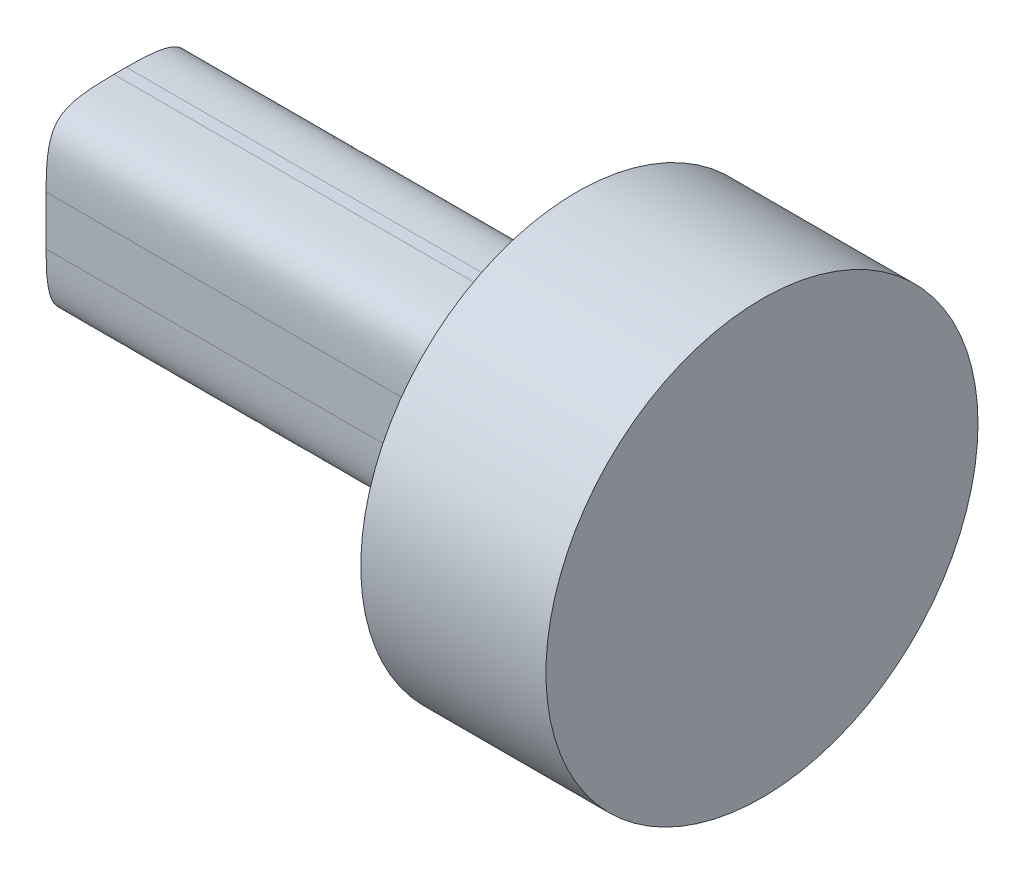
ISO-10303-21;
HEADER;
FILE_DESCRIPTION(('STEP AP214'),'2;1');
FILE_NAME('part.step','',(''),(''),'','','');
FILE_SCHEMA(('AUTOMOTIVE_DESIGN { 1 0 10303 214 1 1 1 1 }'));
ENDSEC;
DATA;
#1=APPLICATION_CONTEXT('core data for automotive mechanical design processes');
#2=APPLICATION_PROTOCOL_DEFINITION('international standard','automotive_design',2000,#1);
#3=PRODUCT_CONTEXT('',#1,'mechanical');
#4=PRODUCT('Part','Part','',(#3));
#5=PRODUCT_RELATED_PRODUCT_CATEGORY('part','',(#4));
#6=PRODUCT_DEFINITION_FORMATION('','',#4);
#7=PRODUCT_DEFINITION_CONTEXT('part definition',#1,'design');
#8=PRODUCT_DEFINITION('design','',#6,#7);
#9=PRODUCT_DEFINITION_SHAPE('','',#8);
#10=(LENGTH_UNIT() NAMED_UNIT(*) SI_UNIT(.MILLI.,.METRE.));
#11=(NAMED_UNIT(*) PLANE_ANGLE_UNIT() SI_UNIT($,.RADIAN.));
#12=(NAMED_UNIT(*) SI_UNIT($,.STERADIAN.) SOLID_ANGLE_UNIT());
#13=UNCERTAINTY_MEASURE_WITH_UNIT(LENGTH_MEASURE(1.E-05),#10,'distance_accuracy_value','');
#14=(GEOMETRIC_REPRESENTATION_CONTEXT(3) GLOBAL_UNCERTAINTY_ASSIGNED_CONTEXT((#13)) GLOBAL_UNIT_ASSIGNED_CONTEXT((#10,
#11,#12)) REPRESENTATION_CONTEXT('',''));
#15=CARTESIAN_POINT('',(0.,0.,0.));
#16=DIRECTION('',(0.,0.,1.));
#17=DIRECTION('',(1.,0.,0.));
#18=AXIS2_PLACEMENT_3D('',#15,#16,#17);
#19=CARTESIAN_POINT('',(-184.472583709502,79.796511627907,12.));
#20=DIRECTION('',(1.,0.,0.));
#21=DIRECTION('',(0.,1.,0.));
#22=AXIS2_PLACEMENT_3D('',#19,#20,#21);
#23=PLANE('',#22);
#24=DIRECTION('',(0.,-1.,0.));
#25=VECTOR('',#24,1.);
#26=CARTESIAN_POINT('',(-184.472583709502,79.796511627907,0.));
#27=LINE('',#26,#25);
#28=CARTESIAN_POINT('',(-184.472583709502,74.2965116279069,0.));
#29=VERTEX_POINT('',#28);
#30=CARTESIAN_POINT('',(-184.472583709502,70.296511627907,0.));
#31=VERTEX_POINT('',#30);
#32=EDGE_CURVE('E229',#29,#31,#27,.T.);
#33=ORIENTED_EDGE('',*,*,#32,.T.);
#34=CARTESIAN_POINT('',(-184.472583709502,64.796511627907,5.5));
#35=CARTESIAN_POINT('',(-184.472583709502,64.7965116279069,0.));
#36=CARTESIAN_POINT('',(-184.472583709502,70.296511627907,0.));
#37=(BOUNDED_CURVE() B_SPLINE_CURVE(2,(#34,#35,#36),.UNSPECIFIED.,.F.,
.F.) B_SPLINE_CURVE_WITH_KNOTS((3,3),(0.,1.),
.UNSPECIFIED.) CURVE() GEOMETRIC_REPRESENTATION_ITEM() RATIONAL_B_SPLINE_CURVE((1.,
1.85714285714286,1.)) REPRESENTATION_ITEM(''));
#38=CARTESIAN_POINT('',(-184.472583709502,64.796511627907,5.5));
#39=VERTEX_POINT('',#38);
#40=EDGE_CURVE('E204',#31,#39,#37,.F.);
#41=ORIENTED_EDGE('',*,*,#40,.T.);
#42=DIRECTION('',(0.,0.,-1.));
#43=VECTOR('',#42,1.);
#44=CARTESIAN_POINT('',(-184.472583709502,64.796511627907,12.));
#45=LINE('',#44,#43);
#46=CARTESIAN_POINT('',(-184.472583709502,64.796511627907,6.5));
#47=VERTEX_POINT('',#46);
#48=EDGE_CURVE('E136',#47,#39,#45,.T.);
#49=ORIENTED_EDGE('',*,*,#48,.F.);
#50=CARTESIAN_POINT('',(-184.472583709502,70.296511627907,12.));
#51=CARTESIAN_POINT('',(-184.472583709502,64.796511627907,12.));
#52=CARTESIAN_POINT('',(-184.472583709502,64.796511627907,6.5));
#53=(BOUNDED_CURVE() B_SPLINE_CURVE(2,(#50,#51,#52),.UNSPECIFIED.,.F.,
.F.) B_SPLINE_CURVE_WITH_KNOTS((3,3),(0.,1.),
.UNSPECIFIED.) CURVE() GEOMETRIC_REPRESENTATION_ITEM() RATIONAL_B_SPLINE_CURVE((1.,
1.85714285714286,1.)) REPRESENTATION_ITEM(''));
#54=CARTESIAN_POINT('',(-184.472583709502,70.296511627907,12.));
#55=VERTEX_POINT('',#54);
#56=EDGE_CURVE('E142',#47,#55,#53,.F.);
#57=ORIENTED_EDGE('',*,*,#56,.T.);
#58=DIRECTION('',(0.,-1.,0.));
#59=VECTOR('',#58,1.);
#60=CARTESIAN_POINT('',(-184.472583709502,79.796511627907,12.));
#61=LINE('',#60,#59);
#62=CARTESIAN_POINT('',(-184.472583709502,74.296511627907,12.));
#63=VERTEX_POINT('',#62);
#64=EDGE_CURVE('E235',#63,#55,#61,.T.);
#65=ORIENTED_EDGE('',*,*,#64,.F.);
#66=CARTESIAN_POINT('',(-184.472583709502,79.796511627907,6.5));
#67=CARTESIAN_POINT('',(-184.472583709502,79.796511627907,12.));
#68=CARTESIAN_POINT('',(-184.472583709502,74.2965116279069,12.));
#69=(BOUNDED_CURVE() B_SPLINE_CURVE(2,(#66,#67,#68),.UNSPECIFIED.,.F.,
.F.) B_SPLINE_CURVE_WITH_KNOTS((3,3),(0.,1.),
.UNSPECIFIED.) CURVE() GEOMETRIC_REPRESENTATION_ITEM() RATIONAL_B_SPLINE_CURVE((1.,
1.85714285714286,1.)) REPRESENTATION_ITEM(''));
#70=CARTESIAN_POINT('',(-184.472583709502,79.796511627907,6.5));
#71=VERTEX_POINT('',#70);
#72=EDGE_CURVE('E214',#63,#71,#69,.F.);
#73=ORIENTED_EDGE('',*,*,#72,.T.);
#74=DIRECTION('',(0.,0.,-1.));
#75=VECTOR('',#74,1.);
#76=CARTESIAN_POINT('',(-184.472583709502,79.796511627907,12.));
#77=LINE('',#76,#75);
#78=CARTESIAN_POINT('',(-184.472583709502,79.796511627907,5.5));
#79=VERTEX_POINT('',#78);
#80=EDGE_CURVE('E328',#71,#79,#77,.T.);
#81=ORIENTED_EDGE('',*,*,#80,.T.);
#82=CARTESIAN_POINT('',(-184.472583709502,74.2965116279069,0.));
#83=CARTESIAN_POINT('',(-184.472583709502,79.796511627907,0.));
#84=CARTESIAN_POINT('',(-184.472583709502,79.796511627907,5.5));
#85=(BOUNDED_CURVE() B_SPLINE_CURVE(2,(#82,#83,#84),.UNSPECIFIED.,.F.,
.F.) B_SPLINE_CURVE_WITH_KNOTS((3,3),(0.,1.),
.UNSPECIFIED.) CURVE() GEOMETRIC_REPRESENTATION_ITEM() RATIONAL_B_SPLINE_CURVE((1.,
1.85714285714286,1.)) REPRESENTATION_ITEM(''));
#86=EDGE_CURVE('E212',#79,#29,#85,.F.);
#87=ORIENTED_EDGE('',*,*,#86,.T.);
#88=EDGE_LOOP('',(#33,#41,#49,#57,#65,#73,#81,#87));
#89=FACE_BOUND('',#88,.T.);
#90=ADVANCED_FACE('F38',(#89),#23,.F.);
#91=CARTESIAN_POINT('',(-184.472583709502,64.796511627907,12.));
#92=DIRECTION('',(0.,1.,0.));
#93=DIRECTION('',(0.,0.,1.));
#94=AXIS2_PLACEMENT_3D('',#91,#92,#93);
#95=PLANE('',#94);
#96=ORIENTED_EDGE('',*,*,#48,.T.);
#97=CARTESIAN_POINT('',(-145.622583709502,64.796511627907,5.5));
#98=CARTESIAN_POINT('',(-159.189250376169,64.796511627907,5.5));
#99=CARTESIAN_POINT('',(-172.755917042836,64.796511627907,5.5));
#100=CARTESIAN_POINT('',(-186.322583709502,64.796511627907,5.5));
#101=(BOUNDED_CURVE() B_SPLINE_CURVE(3,(#97,#98,#99,#100),.UNSPECIFIED.,.F.,
.F.) B_SPLINE_CURVE_WITH_KNOTS((4,4),(-0.00185,0.03885),
.UNSPECIFIED.) CURVE() GEOMETRIC_REPRESENTATION_ITEM() RATIONAL_B_SPLINE_CURVE((1.,1.,1.,1.)) REPRESENTATION_ITEM(''));
#102=CARTESIAN_POINT('',(-147.472583709502,64.796511627907,5.5));
#103=VERTEX_POINT('',#102);
#104=EDGE_CURVE('E134',#39,#103,#101,.F.);
#105=ORIENTED_EDGE('',*,*,#104,.T.);
#106=DIRECTION('',(0.,0.,-1.));
#107=VECTOR('',#106,1.);
#108=CARTESIAN_POINT('',(-147.472583709502,64.796511627907,12.));
#109=LINE('',#108,#107);
#110=CARTESIAN_POINT('',(-147.472583709502,64.796511627907,6.5));
#111=VERTEX_POINT('',#110);
#112=EDGE_CURVE('E115',#111,#103,#109,.T.);
#113=ORIENTED_EDGE('',*,*,#112,.F.);
#114=CARTESIAN_POINT('',(-186.322583709502,64.796511627907,6.5));
#115=CARTESIAN_POINT('',(-172.755917042836,64.796511627907,6.5));
#116=CARTESIAN_POINT('',(-159.189250376169,64.796511627907,6.5));
#117=CARTESIAN_POINT('',(-145.622583709502,64.796511627907,6.5));
#118=(BOUNDED_CURVE() B_SPLINE_CURVE(3,(#114,#115,#116,#117),.UNSPECIFIED.,.F.,
.F.) B_SPLINE_CURVE_WITH_KNOTS((4,4),(0.145622583709502,0.186322583709502),
.UNSPECIFIED.) CURVE() GEOMETRIC_REPRESENTATION_ITEM() RATIONAL_B_SPLINE_CURVE((1.,1.,1.,1.)) REPRESENTATION_ITEM(''));
#119=EDGE_CURVE('E130',#111,#47,#118,.F.);
#120=ORIENTED_EDGE('',*,*,#119,.T.);
#121=EDGE_LOOP('',(#96,#105,#113,#120));
#122=FACE_BOUND('',#121,.T.);
#123=ADVANCED_FACE('F129',(#122),#95,.F.);
#124=CARTESIAN_POINT('',(-184.472583709502,79.796511627907,12.));
#125=DIRECTION('',(0.,-1.,0.));
#126=DIRECTION('',(0.,0.,-1.));
#127=AXIS2_PLACEMENT_3D('',#124,#125,#126);
#128=PLANE('',#127);
#129=DIRECTION('',(0.,0.,-1.));
#130=VECTOR('',#129,1.);
#131=CARTESIAN_POINT('',(-147.472583709502,79.796511627907,12.));
#132=LINE('',#131,#130);
#133=CARTESIAN_POINT('',(-147.472583709502,79.796511627907,6.5));
#134=VERTEX_POINT('',#133);
#135=CARTESIAN_POINT('',(-147.472583709502,79.796511627907,5.5));
#136=VERTEX_POINT('',#135);
#137=EDGE_CURVE('E137',#134,#136,#132,.T.);
#138=ORIENTED_EDGE('',*,*,#137,.T.);
#139=CARTESIAN_POINT('',(-186.322583709502,79.796511627907,5.5));
#140=CARTESIAN_POINT('',(-172.755917042836,79.796511627907,5.5));
#141=CARTESIAN_POINT('',(-159.189250376169,79.796511627907,5.5));
#142=CARTESIAN_POINT('',(-145.622583709502,79.796511627907,5.5));
#143=(BOUNDED_CURVE() B_SPLINE_CURVE(3,(#139,#140,#141,#142),.UNSPECIFIED.,.F.,
.F.) B_SPLINE_CURVE_WITH_KNOTS((4,4),(-0.03885,0.00185),
.UNSPECIFIED.) CURVE() GEOMETRIC_REPRESENTATION_ITEM() RATIONAL_B_SPLINE_CURVE((1.,1.,1.,1.)) REPRESENTATION_ITEM(''));
#144=EDGE_CURVE('E202',#136,#79,#143,.F.);
#145=ORIENTED_EDGE('',*,*,#144,.T.);
#146=ORIENTED_EDGE('',*,*,#80,.F.);
#147=CARTESIAN_POINT('',(-145.622583709502,79.796511627907,6.5));
#148=CARTESIAN_POINT('',(-159.189250376169,79.796511627907,6.5));
#149=CARTESIAN_POINT('',(-172.755917042836,79.796511627907,6.5));
#150=CARTESIAN_POINT('',(-186.322583709502,79.796511627907,6.5));
#151=(BOUNDED_CURVE() B_SPLINE_CURVE(3,(#147,#148,#149,#150),.UNSPECIFIED.,.F.,
.F.) B_SPLINE_CURVE_WITH_KNOTS((4,4),(-0.186322583709502,-0.145622583709502),
.UNSPECIFIED.) CURVE() GEOMETRIC_REPRESENTATION_ITEM() RATIONAL_B_SPLINE_CURVE((1.,1.,1.,1.)) REPRESENTATION_ITEM(''));
#152=EDGE_CURVE('E66',#71,#134,#151,.F.);
#153=ORIENTED_EDGE('',*,*,#152,.T.);
#154=EDGE_LOOP('',(#138,#145,#146,#153));
#155=FACE_BOUND('',#154,.T.);
#156=ADVANCED_FACE('F296',(#155),#128,.F.);
#157=CARTESIAN_POINT('',(0.,0.,12.));
#158=DIRECTION('',(0.,0.,1.));
#159=DIRECTION('',(1.,0.,0.));
#160=AXIS2_PLACEMENT_3D('',#157,#158,#159);
#161=PLANE('',#160);
#162=ORIENTED_EDGE('',*,*,#64,.T.);
#163=CARTESIAN_POINT('',(-145.622583709502,70.296511627907,12.));
#164=CARTESIAN_POINT('',(-159.189250376169,70.296511627907,12.));
#165=CARTESIAN_POINT('',(-172.755917042836,70.296511627907,12.));
#166=CARTESIAN_POINT('',(-186.322583709502,70.296511627907,12.));
#167=(BOUNDED_CURVE() B_SPLINE_CURVE(3,(#163,#164,#165,#166),.UNSPECIFIED.,.F.,
.F.) B_SPLINE_CURVE_WITH_KNOTS((4,4),(0.145622583709502,0.186322583709502),
.UNSPECIFIED.) CURVE() GEOMETRIC_REPRESENTATION_ITEM() RATIONAL_B_SPLINE_CURVE((1.,1.,1.,1.)) REPRESENTATION_ITEM(''));
#168=CARTESIAN_POINT('',(-147.472583709502,70.296511627907,12.));
#169=VERTEX_POINT('',#168);
#170=EDGE_CURVE('E197',#55,#169,#167,.F.);
#171=ORIENTED_EDGE('',*,*,#170,.T.);
#172=DIRECTION('',(0.,1.,0.));
#173=VECTOR('',#172,1.);
#174=CARTESIAN_POINT('',(-147.472583709502,79.796511627907,12.));
#175=LINE('',#174,#173);
#176=CARTESIAN_POINT('',(-147.472583709502,74.2965116279069,12.));
#177=VERTEX_POINT('',#176);
#178=EDGE_CURVE('E117',#169,#177,#175,.T.);
#179=ORIENTED_EDGE('',*,*,#178,.T.);
#180=CARTESIAN_POINT('',(-186.322583709502,74.2965116279069,12.));
#181=CARTESIAN_POINT('',(-172.755917042836,74.2965116279069,12.));
#182=CARTESIAN_POINT('',(-159.189250376169,74.2965116279069,12.));
#183=CARTESIAN_POINT('',(-145.622583709502,74.2965116279069,12.));
#184=(BOUNDED_CURVE() B_SPLINE_CURVE(3,(#180,#181,#182,#183),.UNSPECIFIED.,.F.,
.F.) B_SPLINE_CURVE_WITH_KNOTS((4,4),(-0.186322583709502,-0.145622583709502),
.UNSPECIFIED.) CURVE() GEOMETRIC_REPRESENTATION_ITEM() RATIONAL_B_SPLINE_CURVE((1.,1.,1.,1.)) REPRESENTATION_ITEM(''));
#185=EDGE_CURVE('E201',#177,#63,#184,.F.);
#186=ORIENTED_EDGE('',*,*,#185,.T.);
#187=EDGE_LOOP('',(#162,#171,#179,#186));
#188=FACE_BOUND('',#187,.T.);
#189=ADVANCED_FACE('F383',(#188),#161,.T.);
#190=CARTESIAN_POINT('',(0.,0.,0.));
#191=DIRECTION('',(0.,0.,1.));
#192=DIRECTION('',(1.,0.,0.));
#193=AXIS2_PLACEMENT_3D('',#190,#191,#192);
#194=PLANE('',#193);
#195=DIRECTION('',(0.,1.,0.));
#196=VECTOR('',#195,1.);
#197=CARTESIAN_POINT('',(-147.472583709502,79.796511627907,0.));
#198=LINE('',#197,#196);
#199=CARTESIAN_POINT('',(-147.472583709502,70.296511627907,0.));
#200=VERTEX_POINT('',#199);
#201=CARTESIAN_POINT('',(-147.472583709502,74.2965116279069,0.));
#202=VERTEX_POINT('',#201);
#203=EDGE_CURVE('E228',#200,#202,#198,.T.);
#204=ORIENTED_EDGE('',*,*,#203,.F.);
#205=CARTESIAN_POINT('',(-186.322583709502,70.296511627907,0.));
#206=CARTESIAN_POINT('',(-172.755917042836,70.296511627907,0.));
#207=CARTESIAN_POINT('',(-159.189250376169,70.296511627907,0.));
#208=CARTESIAN_POINT('',(-145.622583709502,70.296511627907,0.));
#209=(BOUNDED_CURVE() B_SPLINE_CURVE(3,(#205,#206,#207,#208),.UNSPECIFIED.,.F.,
.F.) B_SPLINE_CURVE_WITH_KNOTS((4,4),(-0.00185,0.03885),
.UNSPECIFIED.) CURVE() GEOMETRIC_REPRESENTATION_ITEM() RATIONAL_B_SPLINE_CURVE((1.,1.,1.,1.)) REPRESENTATION_ITEM(''));
#210=EDGE_CURVE('E218',#200,#31,#209,.F.);
#211=ORIENTED_EDGE('',*,*,#210,.T.);
#212=ORIENTED_EDGE('',*,*,#32,.F.);
#213=CARTESIAN_POINT('',(-145.622583709502,74.2965116279069,0.));
#214=CARTESIAN_POINT('',(-159.189250376169,74.2965116279069,0.));
#215=CARTESIAN_POINT('',(-172.755917042836,74.2965116279069,0.));
#216=CARTESIAN_POINT('',(-186.322583709502,74.2965116279069,0.));
#217=(BOUNDED_CURVE() B_SPLINE_CURVE(3,(#213,#214,#215,#216),.UNSPECIFIED.,.F.,
.F.) B_SPLINE_CURVE_WITH_KNOTS((4,4),(-0.03885,0.00185),
.UNSPECIFIED.) CURVE() GEOMETRIC_REPRESENTATION_ITEM() RATIONAL_B_SPLINE_CURVE((1.,1.,1.,1.)) REPRESENTATION_ITEM(''));
#218=EDGE_CURVE('E220',#29,#202,#217,.F.);
#219=ORIENTED_EDGE('',*,*,#218,.T.);
#220=EDGE_LOOP('',(#204,#211,#212,#219));
#221=FACE_BOUND('',#220,.T.);
#222=ADVANCED_FACE('F227',(#221),#194,.F.);
#223=CARTESIAN_POINT('',(-132.472583709502,72.296511627907,6.));
#224=DIRECTION('',(-1.,0.,0.));
#225=DIRECTION('',(0.,0.,1.));
#226=AXIS2_PLACEMENT_3D('',#223,#224,#225);
#227=CYLINDRICAL_SURFACE('',#226,17.5);
#228=CARTESIAN_POINT('',(-132.472583709502,72.296511627907,6.));
#229=DIRECTION('',(1.,0.,0.));
#230=DIRECTION('',(0.,0.,-1.));
#231=AXIS2_PLACEMENT_3D('',#228,#229,#230);
#232=CIRCLE('',#231,17.5);
#233=CARTESIAN_POINT('',(-132.472583709502,72.296511627907,-11.5));
#234=VERTEX_POINT('',#233);
#235=EDGE_CURVE('E341',#234,#234,#232,.T.);
#236=ORIENTED_EDGE('',*,*,#235,.F.);
#237=EDGE_LOOP('',(#236));
#238=FACE_BOUND('',#237,.T.);
#239=CARTESIAN_POINT('',(-147.472583709502,72.296511627907,6.));
#240=DIRECTION('',(1.,0.,0.));
#241=DIRECTION('',(0.,0.,-1.));
#242=AXIS2_PLACEMENT_3D('',#239,#240,#241);
#243=CIRCLE('',#242,17.5);
#244=CARTESIAN_POINT('',(-147.472583709502,72.296511627907,-11.5));
#245=VERTEX_POINT('',#244);
#246=EDGE_CURVE('E456',#245,#245,#243,.T.);
#247=ORIENTED_EDGE('',*,*,#246,.T.);
#248=EDGE_LOOP('',(#247));
#249=FACE_BOUND('',#248,.T.);
#250=ADVANCED_FACE('F406',(#238,#249),#227,.T.);
#251=CARTESIAN_POINT('',(-132.472583709502,72.296511627907,6.));
#252=DIRECTION('',(1.,0.,0.));
#253=DIRECTION('',(0.,0.,-1.));
#254=AXIS2_PLACEMENT_3D('',#251,#252,#253);
#255=PLANE('',#254);
#256=ORIENTED_EDGE('',*,*,#235,.T.);
#257=EDGE_LOOP('',(#256));
#258=FACE_BOUND('',#257,.T.);
#259=ADVANCED_FACE('F405',(#258),#255,.T.);
#260=CARTESIAN_POINT('',(-147.472583709502,72.296511627907,6.));
#261=DIRECTION('',(1.,0.,0.));
#262=DIRECTION('',(0.,0.,-1.));
#263=AXIS2_PLACEMENT_3D('',#260,#261,#262);
#264=PLANE('',#263);
#265=ORIENTED_EDGE('',*,*,#178,.F.);
#266=CARTESIAN_POINT('',(-147.472583709502,64.796511627907,6.5));
#267=CARTESIAN_POINT('',(-147.472583709502,64.796511627907,12.));
#268=CARTESIAN_POINT('',(-147.472583709502,70.296511627907,12.));
#269=(BOUNDED_CURVE() B_SPLINE_CURVE(2,(#266,#267,#268),.UNSPECIFIED.,.F.,
.F.) B_SPLINE_CURVE_WITH_KNOTS((3,3),(0.,1.),
.UNSPECIFIED.) CURVE() GEOMETRIC_REPRESENTATION_ITEM() RATIONAL_B_SPLINE_CURVE((1.,
1.85714285714286,1.)) REPRESENTATION_ITEM(''));
#270=EDGE_CURVE('E110',#169,#111,#269,.F.);
#271=ORIENTED_EDGE('',*,*,#270,.T.);
#272=ORIENTED_EDGE('',*,*,#112,.T.);
#273=CARTESIAN_POINT('',(-147.472583709502,70.296511627907,0.));
#274=CARTESIAN_POINT('',(-147.472583709502,64.796511627907,0.));
#275=CARTESIAN_POINT('',(-147.472583709502,64.796511627907,5.5));
#276=(BOUNDED_CURVE() B_SPLINE_CURVE(2,(#273,#274,#275),.UNSPECIFIED.,.F.,
.F.) B_SPLINE_CURVE_WITH_KNOTS((3,3),(0.,1.),
.UNSPECIFIED.) CURVE() GEOMETRIC_REPRESENTATION_ITEM() RATIONAL_B_SPLINE_CURVE((1.,
1.85714285714286,1.)) REPRESENTATION_ITEM(''));
#277=EDGE_CURVE('E123',#103,#200,#276,.F.);
#278=ORIENTED_EDGE('',*,*,#277,.T.);
#279=ORIENTED_EDGE('',*,*,#203,.T.);
#280=CARTESIAN_POINT('',(-147.472583709502,79.796511627907,5.5));
#281=CARTESIAN_POINT('',(-147.472583709502,79.796511627907,0.));
#282=CARTESIAN_POINT('',(-147.472583709502,74.2965116279069,0.));
#283=(BOUNDED_CURVE() B_SPLINE_CURVE(2,(#280,#281,#282),.UNSPECIFIED.,.F.,
.F.) B_SPLINE_CURVE_WITH_KNOTS((3,3),(0.,1.),
.UNSPECIFIED.) CURVE() GEOMETRIC_REPRESENTATION_ITEM() RATIONAL_B_SPLINE_CURVE((1.,
1.85714285714286,1.)) REPRESENTATION_ITEM(''));
#284=EDGE_CURVE('E52',#202,#136,#283,.F.);
#285=ORIENTED_EDGE('',*,*,#284,.T.);
#286=ORIENTED_EDGE('',*,*,#137,.F.);
#287=CARTESIAN_POINT('',(-147.472583709502,74.2965116279069,12.));
#288=CARTESIAN_POINT('',(-147.472583709502,79.796511627907,12.));
#289=CARTESIAN_POINT('',(-147.472583709502,79.796511627907,6.5));
#290=(BOUNDED_CURVE() B_SPLINE_CURVE(2,(#287,#288,#289),.UNSPECIFIED.,.F.,
.F.) B_SPLINE_CURVE_WITH_KNOTS((3,3),(0.,1.),
.UNSPECIFIED.) CURVE() GEOMETRIC_REPRESENTATION_ITEM() RATIONAL_B_SPLINE_CURVE((1.,
1.85714285714286,1.)) REPRESENTATION_ITEM(''));
#291=EDGE_CURVE('E12',#134,#177,#290,.F.);
#292=ORIENTED_EDGE('',*,*,#291,.T.);
#293=EDGE_LOOP('',(#265,#271,#272,#278,#279,#285,#286,#292));
#294=FACE_BOUND('',#293,.T.);
#295=ORIENTED_EDGE('',*,*,#246,.F.);
#296=EDGE_LOOP('',(#295));
#297=FACE_BOUND('',#296,.T.);
#298=ADVANCED_FACE('F113',(#294,#297),#264,.F.);
#299=CARTESIAN_POINT('',(-186.322583709502,64.796511627907,5.5));
#300=CARTESIAN_POINT('',(-172.755917042836,64.796511627907,5.5));
#301=CARTESIAN_POINT('',(-159.189250376169,64.796511627907,5.5));
#302=CARTESIAN_POINT('',(-145.622583709502,64.796511627907,5.5));
#303=CARTESIAN_POINT('',(-186.322583709502,64.796511627907,0.));
#304=CARTESIAN_POINT('',(-172.755917042836,64.796511627907,0.));
#305=CARTESIAN_POINT('',(-159.189250376169,64.796511627907,0.));
#306=CARTESIAN_POINT('',(-145.622583709502,64.796511627907,0.));
#307=CARTESIAN_POINT('',(-186.322583709502,70.296511627907,0.));
#308=CARTESIAN_POINT('',(-172.755917042836,70.296511627907,0.));
#309=CARTESIAN_POINT('',(-159.189250376169,70.296511627907,0.));
#310=CARTESIAN_POINT('',(-145.622583709502,70.296511627907,0.));
#311=(BOUNDED_SURFACE() B_SPLINE_SURFACE(2,3,((#299,#300,#301,#302),(#303,#304,#305,#306),(#307,
#308,#309,#310)),.UNSPECIFIED.,.F.,.F.,.F.) B_SPLINE_SURFACE_WITH_KNOTS((3,3),(4,4),(0.,1.),
(-0.00185,0.03885),
.UNSPECIFIED.) GEOMETRIC_REPRESENTATION_ITEM() RATIONAL_B_SPLINE_SURFACE(((1.,1.,1.,1.),
(1.85714285714286,1.85714285714286,1.85714285714286,1.85714285714286),(1.,1.,1.,1.))) REPRESENTATION_ITEM('') SURFACE());
#312=ORIENTED_EDGE('',*,*,#40,.F.);
#313=ORIENTED_EDGE('',*,*,#210,.F.);
#314=ORIENTED_EDGE('',*,*,#277,.F.);
#315=ORIENTED_EDGE('',*,*,#104,.F.);
#316=EDGE_LOOP('',(#312,#313,#314,#315));
#317=FACE_BOUND('',#316,.T.);
#318=ADVANCED_FACE('F169',(#317),#311,.T.);
#319=CARTESIAN_POINT('',(-145.622583709502,64.796511627907,6.5));
#320=CARTESIAN_POINT('',(-159.189250376169,64.796511627907,6.5));
#321=CARTESIAN_POINT('',(-172.755917042836,64.796511627907,6.5));
#322=CARTESIAN_POINT('',(-186.322583709502,64.796511627907,6.5));
#323=CARTESIAN_POINT('',(-145.622583709502,64.796511627907,12.));
#324=CARTESIAN_POINT('',(-159.189250376169,64.796511627907,12.));
#325=CARTESIAN_POINT('',(-172.755917042836,64.796511627907,12.));
#326=CARTESIAN_POINT('',(-186.322583709502,64.796511627907,12.));
#327=CARTESIAN_POINT('',(-145.622583709502,70.296511627907,12.));
#328=CARTESIAN_POINT('',(-159.189250376169,70.296511627907,12.));
#329=CARTESIAN_POINT('',(-172.755917042836,70.296511627907,12.));
#330=CARTESIAN_POINT('',(-186.322583709502,70.296511627907,12.));
#331=(BOUNDED_SURFACE() B_SPLINE_SURFACE(2,3,((#319,#320,#321,#322),(#323,#324,#325,#326),(#327,
#328,#329,#330)),.UNSPECIFIED.,.F.,.F.,.F.) B_SPLINE_SURFACE_WITH_KNOTS((3,3),(4,4),(0.,1.),
(0.145622583709502,0.186322583709502),
.UNSPECIFIED.) GEOMETRIC_REPRESENTATION_ITEM() RATIONAL_B_SPLINE_SURFACE(((1.,1.,1.,1.),
(1.85714285714286,1.85714285714286,1.85714285714286,1.85714285714286),(1.,1.,1.,1.))) REPRESENTATION_ITEM('') SURFACE());
#332=ORIENTED_EDGE('',*,*,#56,.F.);
#333=ORIENTED_EDGE('',*,*,#119,.F.);
#334=ORIENTED_EDGE('',*,*,#270,.F.);
#335=ORIENTED_EDGE('',*,*,#170,.F.);
#336=EDGE_LOOP('',(#332,#333,#334,#335));
#337=FACE_BOUND('',#336,.T.);
#338=ADVANCED_FACE('F141',(#337),#331,.T.);
#339=CARTESIAN_POINT('',(-145.622583709502,79.796511627907,5.5));
#340=CARTESIAN_POINT('',(-159.189250376169,79.796511627907,5.5));
#341=CARTESIAN_POINT('',(-172.755917042836,79.796511627907,5.5));
#342=CARTESIAN_POINT('',(-186.322583709502,79.796511627907,5.5));
#343=CARTESIAN_POINT('',(-145.622583709502,79.796511627907,0.));
#344=CARTESIAN_POINT('',(-159.189250376169,79.796511627907,0.));
#345=CARTESIAN_POINT('',(-172.755917042836,79.796511627907,0.));
#346=CARTESIAN_POINT('',(-186.322583709502,79.796511627907,0.));
#347=CARTESIAN_POINT('',(-145.622583709502,74.2965116279069,0.));
#348=CARTESIAN_POINT('',(-159.189250376169,74.2965116279069,0.));
#349=CARTESIAN_POINT('',(-172.755917042836,74.2965116279069,0.));
#350=CARTESIAN_POINT('',(-186.322583709502,74.2965116279069,0.));
#351=(BOUNDED_SURFACE() B_SPLINE_SURFACE(2,3,((#339,#340,#341,#342),(#343,#344,#345,#346),(#347,
#348,#349,#350)),.UNSPECIFIED.,.F.,.F.,.F.) B_SPLINE_SURFACE_WITH_KNOTS((3,3),(4,4),(0.,1.),
(-0.03885,0.00185),
.UNSPECIFIED.) GEOMETRIC_REPRESENTATION_ITEM() RATIONAL_B_SPLINE_SURFACE(((1.,1.,1.,1.),
(1.85714285714286,1.85714285714286,1.85714285714286,1.85714285714286),(1.,1.,1.,1.))) REPRESENTATION_ITEM('') SURFACE());
#352=ORIENTED_EDGE('',*,*,#284,.F.);
#353=ORIENTED_EDGE('',*,*,#218,.F.);
#354=ORIENTED_EDGE('',*,*,#86,.F.);
#355=ORIENTED_EDGE('',*,*,#144,.F.);
#356=EDGE_LOOP('',(#352,#353,#354,#355));
#357=FACE_BOUND('',#356,.T.);
#358=ADVANCED_FACE('F168',(#357),#351,.T.);
#359=CARTESIAN_POINT('',(-186.322583709502,79.796511627907,6.5));
#360=CARTESIAN_POINT('',(-172.755917042836,79.796511627907,6.5));
#361=CARTESIAN_POINT('',(-159.189250376169,79.796511627907,6.5));
#362=CARTESIAN_POINT('',(-145.622583709502,79.796511627907,6.5));
#363=CARTESIAN_POINT('',(-186.322583709502,79.796511627907,12.));
#364=CARTESIAN_POINT('',(-172.755917042836,79.796511627907,12.));
#365=CARTESIAN_POINT('',(-159.189250376169,79.796511627907,12.));
#366=CARTESIAN_POINT('',(-145.622583709502,79.796511627907,12.));
#367=CARTESIAN_POINT('',(-186.322583709502,74.2965116279069,12.));
#368=CARTESIAN_POINT('',(-172.755917042836,74.2965116279069,12.));
#369=CARTESIAN_POINT('',(-159.189250376169,74.2965116279069,12.));
#370=CARTESIAN_POINT('',(-145.622583709502,74.2965116279069,12.));
#371=(BOUNDED_SURFACE() B_SPLINE_SURFACE(2,3,((#359,#360,#361,#362),(#363,#364,#365,#366),(#367,
#368,#369,#370)),.UNSPECIFIED.,.F.,.F.,.F.) B_SPLINE_SURFACE_WITH_KNOTS((3,3),(4,4),(0.,1.),
(-0.186322583709502,-0.145622583709502),
.UNSPECIFIED.) GEOMETRIC_REPRESENTATION_ITEM() RATIONAL_B_SPLINE_SURFACE(((1.,1.,1.,1.),
(1.85714285714286,1.85714285714286,1.85714285714286,1.85714285714286),(1.,1.,1.,1.))) REPRESENTATION_ITEM('') SURFACE());
#372=ORIENTED_EDGE('',*,*,#291,.F.);
#373=ORIENTED_EDGE('',*,*,#152,.F.);
#374=ORIENTED_EDGE('',*,*,#72,.F.);
#375=ORIENTED_EDGE('',*,*,#185,.F.);
#376=EDGE_LOOP('',(#372,#373,#374,#375));
#377=FACE_BOUND('',#376,.T.);
#378=ADVANCED_FACE('F41',(#377),#371,.T.);
#379=CLOSED_SHELL('',(#90,#123,#156,#189,#222,#250,#259,#298,#318,#338,#358,#378));
#380=MANIFOLD_SOLID_BREP('B2',#379);
#381=ADVANCED_BREP_SHAPE_REPRESENTATION('',(#18,#380),#14);
#382=SHAPE_DEFINITION_REPRESENTATION(#9,#381);
ENDSEC;
END-ISO-10303-21;
